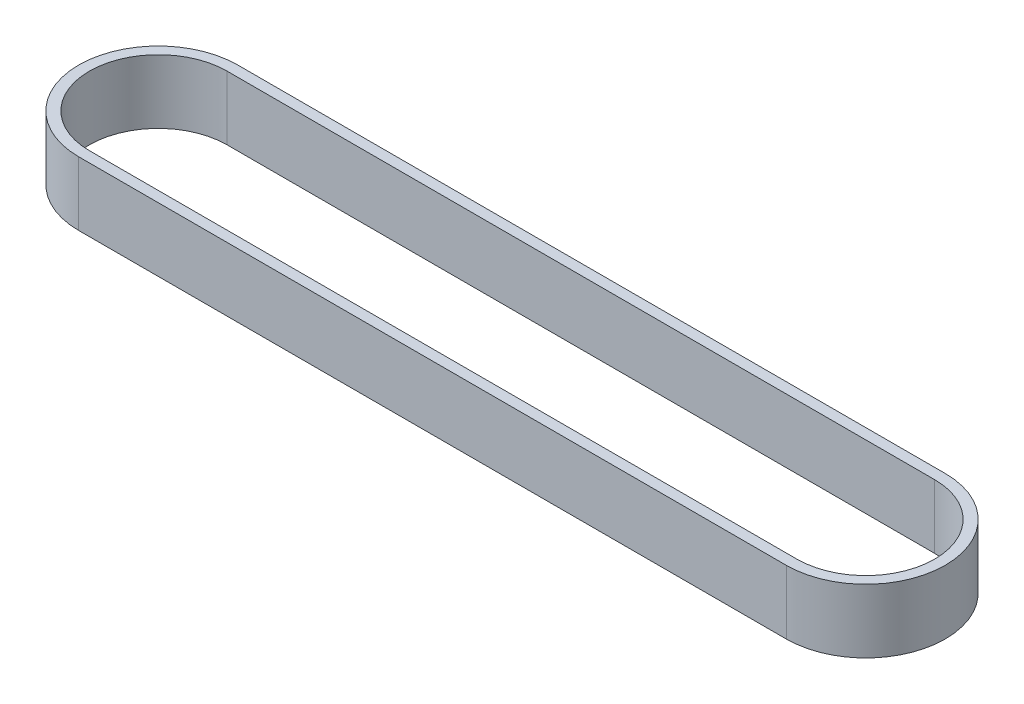
ISO-10303-21;
HEADER;
FILE_DESCRIPTION(('STEP AP214'),'2;1');
FILE_NAME('part.step','',(''),(''),'','','');
FILE_SCHEMA(('AUTOMOTIVE_DESIGN { 1 0 10303 214 1 1 1 1 }'));
ENDSEC;
DATA;
#1=APPLICATION_CONTEXT('core data for automotive mechanical design processes');
#2=APPLICATION_PROTOCOL_DEFINITION('international standard','automotive_design',2000,#1);
#3=PRODUCT_CONTEXT('',#1,'mechanical');
#4=PRODUCT('Part','Part','',(#3));
#5=PRODUCT_RELATED_PRODUCT_CATEGORY('part','',(#4));
#6=PRODUCT_DEFINITION_FORMATION('','',#4);
#7=PRODUCT_DEFINITION_CONTEXT('part definition',#1,'design');
#8=PRODUCT_DEFINITION('design','',#6,#7);
#9=PRODUCT_DEFINITION_SHAPE('','',#8);
#10=(LENGTH_UNIT() NAMED_UNIT(*) SI_UNIT(.MILLI.,.METRE.));
#11=(NAMED_UNIT(*) PLANE_ANGLE_UNIT() SI_UNIT($,.RADIAN.));
#12=(NAMED_UNIT(*) SI_UNIT($,.STERADIAN.) SOLID_ANGLE_UNIT());
#13=UNCERTAINTY_MEASURE_WITH_UNIT(LENGTH_MEASURE(1.E-05),#10,'distance_accuracy_value','');
#14=(GEOMETRIC_REPRESENTATION_CONTEXT(3) GLOBAL_UNCERTAINTY_ASSIGNED_CONTEXT((#13)) GLOBAL_UNIT_ASSIGNED_CONTEXT((#10,
#11,#12)) REPRESENTATION_CONTEXT('',''));
#15=CARTESIAN_POINT('',(0.,0.,0.));
#16=DIRECTION('',(0.,0.,1.));
#17=DIRECTION('',(1.,0.,0.));
#18=AXIS2_PLACEMENT_3D('',#15,#16,#17);
#19=CARTESIAN_POINT('',(-33.24,6.,0.));
#20=DIRECTION('',(0.,1.,0.));
#21=DIRECTION('',(0.,0.,1.));
#22=AXIS2_PLACEMENT_3D('',#19,#20,#21);
#23=PLANE('',#22);
#24=CARTESIAN_POINT('',(-33.24,6.,0.));
#25=DIRECTION('',(0.,1.,0.));
#26=DIRECTION('',(0.,0.,1.));
#27=AXIS2_PLACEMENT_3D('',#24,#25,#26);
#28=CIRCLE('',#27,7.47);
#29=CARTESIAN_POINT('',(-33.24,6.,-7.47));
#30=VERTEX_POINT('',#29);
#31=CARTESIAN_POINT('',(-33.24,6.,7.47));
#32=VERTEX_POINT('',#31);
#33=EDGE_CURVE('E133',#30,#32,#28,.T.);
#34=ORIENTED_EDGE('',*,*,#33,.T.);
#35=DIRECTION('',(1.,0.,0.));
#36=VECTOR('',#35,1.);
#37=CARTESIAN_POINT('',(-33.24,6.,7.47));
#38=LINE('',#37,#36);
#39=CARTESIAN_POINT('',(33.24,6.,7.47));
#40=VERTEX_POINT('',#39);
#41=EDGE_CURVE('E136',#32,#40,#38,.T.);
#42=ORIENTED_EDGE('',*,*,#41,.T.);
#43=CARTESIAN_POINT('',(33.24,6.,0.));
#44=DIRECTION('',(0.,1.,0.));
#45=DIRECTION('',(0.,0.,1.));
#46=AXIS2_PLACEMENT_3D('',#43,#44,#45);
#47=CIRCLE('',#46,7.47);
#48=CARTESIAN_POINT('',(33.24,6.,-7.47));
#49=VERTEX_POINT('',#48);
#50=EDGE_CURVE('E139',#40,#49,#47,.T.);
#51=ORIENTED_EDGE('',*,*,#50,.T.);
#52=DIRECTION('',(-1.,0.,0.));
#53=VECTOR('',#52,1.);
#54=CARTESIAN_POINT('',(-33.24,6.,-7.47));
#55=LINE('',#54,#53);
#56=EDGE_CURVE('E141',#49,#30,#55,.T.);
#57=ORIENTED_EDGE('',*,*,#56,.T.);
#58=EDGE_LOOP('',(#34,#42,#51,#57));
#59=FACE_BOUND('',#58,.T.);
#60=DIRECTION('',(-1.,0.,0.));
#61=VECTOR('',#60,1.);
#62=CARTESIAN_POINT('',(-33.24,6.,-6.47));
#63=LINE('',#62,#61);
#64=CARTESIAN_POINT('',(33.24,6.,-6.47));
#65=VERTEX_POINT('',#64);
#66=CARTESIAN_POINT('',(-33.24,6.,-6.47));
#67=VERTEX_POINT('',#66);
#68=EDGE_CURVE('E105',#65,#67,#63,.T.);
#69=ORIENTED_EDGE('',*,*,#68,.F.);
#70=CARTESIAN_POINT('',(33.24,6.,0.));
#71=DIRECTION('',(0.,1.,0.));
#72=DIRECTION('',(0.,0.,1.));
#73=AXIS2_PLACEMENT_3D('',#70,#71,#72);
#74=CIRCLE('',#73,6.47);
#75=CARTESIAN_POINT('',(33.24,6.,6.47));
#76=VERTEX_POINT('',#75);
#77=EDGE_CURVE('E97',#76,#65,#74,.T.);
#78=ORIENTED_EDGE('',*,*,#77,.F.);
#79=DIRECTION('',(1.,0.,0.));
#80=VECTOR('',#79,1.);
#81=CARTESIAN_POINT('',(-33.24,6.,6.47));
#82=LINE('',#81,#80);
#83=CARTESIAN_POINT('',(-33.24,6.,6.47));
#84=VERTEX_POINT('',#83);
#85=EDGE_CURVE('E119',#84,#76,#82,.T.);
#86=ORIENTED_EDGE('',*,*,#85,.F.);
#87=CARTESIAN_POINT('',(-33.24,6.,0.));
#88=DIRECTION('',(0.,1.,0.));
#89=DIRECTION('',(0.,0.,1.));
#90=AXIS2_PLACEMENT_3D('',#87,#88,#89);
#91=CIRCLE('',#90,6.47);
#92=EDGE_CURVE('E117',#67,#84,#91,.T.);
#93=ORIENTED_EDGE('',*,*,#92,.F.);
#94=EDGE_LOOP('',(#69,#78,#86,#93));
#95=FACE_BOUND('',#94,.T.);
#96=ADVANCED_FACE('F32',(#59,#95),#23,.T.);
#97=CARTESIAN_POINT('',(-33.24,0.,0.));
#98=DIRECTION('',(0.,1.,0.));
#99=DIRECTION('',(0.,0.,1.));
#100=AXIS2_PLACEMENT_3D('',#97,#98,#99);
#101=PLANE('',#100);
#102=CARTESIAN_POINT('',(-33.24,0.,0.));
#103=DIRECTION('',(0.,1.,0.));
#104=DIRECTION('',(0.,0.,1.));
#105=AXIS2_PLACEMENT_3D('',#102,#103,#104);
#106=CIRCLE('',#105,7.47);
#107=CARTESIAN_POINT('',(-33.24,0.,-7.47));
#108=VERTEX_POINT('',#107);
#109=CARTESIAN_POINT('',(-33.24,0.,7.47));
#110=VERTEX_POINT('',#109);
#111=EDGE_CURVE('E113',#108,#110,#106,.T.);
#112=ORIENTED_EDGE('',*,*,#111,.F.);
#113=DIRECTION('',(-1.,0.,0.));
#114=VECTOR('',#113,1.);
#115=CARTESIAN_POINT('',(-33.24,0.,-7.47));
#116=LINE('',#115,#114);
#117=CARTESIAN_POINT('',(33.24,0.,-7.47));
#118=VERTEX_POINT('',#117);
#119=EDGE_CURVE('E137',#118,#108,#116,.T.);
#120=ORIENTED_EDGE('',*,*,#119,.F.);
#121=CARTESIAN_POINT('',(33.24,0.,0.));
#122=DIRECTION('',(0.,1.,0.));
#123=DIRECTION('',(0.,0.,1.));
#124=AXIS2_PLACEMENT_3D('',#121,#122,#123);
#125=CIRCLE('',#124,7.47);
#126=CARTESIAN_POINT('',(33.24,0.,7.47));
#127=VERTEX_POINT('',#126);
#128=EDGE_CURVE('E148',#127,#118,#125,.T.);
#129=ORIENTED_EDGE('',*,*,#128,.F.);
#130=DIRECTION('',(1.,0.,0.));
#131=VECTOR('',#130,1.);
#132=CARTESIAN_POINT('',(-33.24,0.,7.47));
#133=LINE('',#132,#131);
#134=EDGE_CURVE('E146',#110,#127,#133,.T.);
#135=ORIENTED_EDGE('',*,*,#134,.F.);
#136=EDGE_LOOP('',(#112,#120,#129,#135));
#137=FACE_BOUND('',#136,.T.);
#138=CARTESIAN_POINT('',(33.24,0.,0.));
#139=DIRECTION('',(0.,1.,0.));
#140=DIRECTION('',(0.,0.,1.));
#141=AXIS2_PLACEMENT_3D('',#138,#139,#140);
#142=CIRCLE('',#141,6.47);
#143=CARTESIAN_POINT('',(33.24,0.,6.47));
#144=VERTEX_POINT('',#143);
#145=CARTESIAN_POINT('',(33.24,0.,-6.47));
#146=VERTEX_POINT('',#145);
#147=EDGE_CURVE('E55',#144,#146,#142,.T.);
#148=ORIENTED_EDGE('',*,*,#147,.T.);
#149=DIRECTION('',(-1.,0.,0.));
#150=VECTOR('',#149,1.);
#151=CARTESIAN_POINT('',(-33.24,0.,-6.47));
#152=LINE('',#151,#150);
#153=CARTESIAN_POINT('',(-33.24,0.,-6.47));
#154=VERTEX_POINT('',#153);
#155=EDGE_CURVE('E112',#146,#154,#152,.T.);
#156=ORIENTED_EDGE('',*,*,#155,.T.);
#157=CARTESIAN_POINT('',(-33.24,0.,0.));
#158=DIRECTION('',(0.,1.,0.));
#159=DIRECTION('',(0.,0.,1.));
#160=AXIS2_PLACEMENT_3D('',#157,#158,#159);
#161=CIRCLE('',#160,6.47);
#162=CARTESIAN_POINT('',(-33.24,0.,6.47));
#163=VERTEX_POINT('',#162);
#164=EDGE_CURVE('E125',#154,#163,#161,.T.);
#165=ORIENTED_EDGE('',*,*,#164,.T.);
#166=DIRECTION('',(1.,0.,0.));
#167=VECTOR('',#166,1.);
#168=CARTESIAN_POINT('',(-33.24,0.,6.47));
#169=LINE('',#168,#167);
#170=EDGE_CURVE('E106',#163,#144,#169,.T.);
#171=ORIENTED_EDGE('',*,*,#170,.T.);
#172=EDGE_LOOP('',(#148,#156,#165,#171));
#173=FACE_BOUND('',#172,.T.);
#174=ADVANCED_FACE('F166',(#137,#173),#101,.F.);
#175=CARTESIAN_POINT('',(-33.24,6.,0.));
#176=DIRECTION('',(0.,-1.,0.));
#177=DIRECTION('',(0.,0.,-1.));
#178=AXIS2_PLACEMENT_3D('',#175,#176,#177);
#179=CYLINDRICAL_SURFACE('',#178,7.47);
#180=ORIENTED_EDGE('',*,*,#111,.T.);
#181=DIRECTION('',(0.,-1.,0.));
#182=VECTOR('',#181,1.);
#183=CARTESIAN_POINT('',(-33.24,6.,7.47));
#184=LINE('',#183,#182);
#185=EDGE_CURVE('E11',#32,#110,#184,.T.);
#186=ORIENTED_EDGE('',*,*,#185,.F.);
#187=ORIENTED_EDGE('',*,*,#33,.F.);
#188=DIRECTION('',(0.,-1.,0.));
#189=VECTOR('',#188,1.);
#190=CARTESIAN_POINT('',(-33.24,6.,-7.47));
#191=LINE('',#190,#189);
#192=EDGE_CURVE('E143',#30,#108,#191,.T.);
#193=ORIENTED_EDGE('',*,*,#192,.T.);
#194=EDGE_LOOP('',(#180,#186,#187,#193));
#195=FACE_BOUND('',#194,.T.);
#196=ADVANCED_FACE('F34',(#195),#179,.T.);
#197=CARTESIAN_POINT('',(-33.24,6.,7.47));
#198=DIRECTION('',(0.,0.,-1.));
#199=DIRECTION('',(-1.,0.,0.));
#200=AXIS2_PLACEMENT_3D('',#197,#198,#199);
#201=PLANE('',#200);
#202=ORIENTED_EDGE('',*,*,#134,.T.);
#203=DIRECTION('',(0.,-1.,0.));
#204=VECTOR('',#203,1.);
#205=CARTESIAN_POINT('',(33.24,6.,7.47));
#206=LINE('',#205,#204);
#207=EDGE_CURVE('E40',#40,#127,#206,.T.);
#208=ORIENTED_EDGE('',*,*,#207,.F.);
#209=ORIENTED_EDGE('',*,*,#41,.F.);
#210=ORIENTED_EDGE('',*,*,#185,.T.);
#211=EDGE_LOOP('',(#202,#208,#209,#210));
#212=FACE_BOUND('',#211,.T.);
#213=ADVANCED_FACE('F176',(#212),#201,.F.);
#214=CARTESIAN_POINT('',(33.24,6.,0.));
#215=DIRECTION('',(0.,-1.,0.));
#216=DIRECTION('',(0.,0.,-1.));
#217=AXIS2_PLACEMENT_3D('',#214,#215,#216);
#218=CYLINDRICAL_SURFACE('',#217,7.47);
#219=ORIENTED_EDGE('',*,*,#128,.T.);
#220=DIRECTION('',(0.,-1.,0.));
#221=VECTOR('',#220,1.);
#222=CARTESIAN_POINT('',(33.24,6.,-7.47));
#223=LINE('',#222,#221);
#224=EDGE_CURVE('E153',#49,#118,#223,.T.);
#225=ORIENTED_EDGE('',*,*,#224,.F.);
#226=ORIENTED_EDGE('',*,*,#50,.F.);
#227=ORIENTED_EDGE('',*,*,#207,.T.);
#228=EDGE_LOOP('',(#219,#225,#226,#227));
#229=FACE_BOUND('',#228,.T.);
#230=ADVANCED_FACE('F160',(#229),#218,.T.);
#231=CARTESIAN_POINT('',(-33.24,6.,-7.47));
#232=DIRECTION('',(0.,0.,1.));
#233=DIRECTION('',(1.,0.,0.));
#234=AXIS2_PLACEMENT_3D('',#231,#232,#233);
#235=PLANE('',#234);
#236=ORIENTED_EDGE('',*,*,#119,.T.);
#237=ORIENTED_EDGE('',*,*,#192,.F.);
#238=ORIENTED_EDGE('',*,*,#56,.F.);
#239=ORIENTED_EDGE('',*,*,#224,.T.);
#240=EDGE_LOOP('',(#236,#237,#238,#239));
#241=FACE_BOUND('',#240,.T.);
#242=ADVANCED_FACE('F170',(#241),#235,.F.);
#243=CARTESIAN_POINT('',(33.24,6.,0.));
#244=DIRECTION('',(0.,-1.,0.));
#245=DIRECTION('',(0.,0.,-1.));
#246=AXIS2_PLACEMENT_3D('',#243,#244,#245);
#247=CYLINDRICAL_SURFACE('',#246,6.47);
#248=ORIENTED_EDGE('',*,*,#147,.F.);
#249=DIRECTION('',(0.,-1.,0.));
#250=VECTOR('',#249,1.);
#251=CARTESIAN_POINT('',(33.24,6.,6.47));
#252=LINE('',#251,#250);
#253=EDGE_CURVE('E101',#76,#144,#252,.T.);
#254=ORIENTED_EDGE('',*,*,#253,.F.);
#255=ORIENTED_EDGE('',*,*,#77,.T.);
#256=DIRECTION('',(0.,-1.,0.));
#257=VECTOR('',#256,1.);
#258=CARTESIAN_POINT('',(33.24,6.,-6.47));
#259=LINE('',#258,#257);
#260=EDGE_CURVE('E100',#65,#146,#259,.T.);
#261=ORIENTED_EDGE('',*,*,#260,.T.);
#262=EDGE_LOOP('',(#248,#254,#255,#261));
#263=FACE_BOUND('',#262,.T.);
#264=ADVANCED_FACE('F99',(#263),#247,.F.);
#265=CARTESIAN_POINT('',(-33.24,6.,-6.47));
#266=DIRECTION('',(0.,0.,1.));
#267=DIRECTION('',(1.,0.,0.));
#268=AXIS2_PLACEMENT_3D('',#265,#266,#267);
#269=PLANE('',#268);
#270=ORIENTED_EDGE('',*,*,#155,.F.);
#271=ORIENTED_EDGE('',*,*,#260,.F.);
#272=ORIENTED_EDGE('',*,*,#68,.T.);
#273=DIRECTION('',(0.,-1.,0.));
#274=VECTOR('',#273,1.);
#275=CARTESIAN_POINT('',(-33.24,6.,-6.47));
#276=LINE('',#275,#274);
#277=EDGE_CURVE('E114',#67,#154,#276,.T.);
#278=ORIENTED_EDGE('',*,*,#277,.T.);
#279=EDGE_LOOP('',(#270,#271,#272,#278));
#280=FACE_BOUND('',#279,.T.);
#281=ADVANCED_FACE('F109',(#280),#269,.T.);
#282=CARTESIAN_POINT('',(-33.24,6.,0.));
#283=DIRECTION('',(0.,-1.,0.));
#284=DIRECTION('',(0.,0.,-1.));
#285=AXIS2_PLACEMENT_3D('',#282,#283,#284);
#286=CYLINDRICAL_SURFACE('',#285,6.47);
#287=ORIENTED_EDGE('',*,*,#164,.F.);
#288=ORIENTED_EDGE('',*,*,#277,.F.);
#289=ORIENTED_EDGE('',*,*,#92,.T.);
#290=DIRECTION('',(0.,-1.,0.));
#291=VECTOR('',#290,1.);
#292=CARTESIAN_POINT('',(-33.24,6.,6.47));
#293=LINE('',#292,#291);
#294=EDGE_CURVE('E47',#84,#163,#293,.T.);
#295=ORIENTED_EDGE('',*,*,#294,.T.);
#296=EDGE_LOOP('',(#287,#288,#289,#295));
#297=FACE_BOUND('',#296,.T.);
#298=ADVANCED_FACE('F199',(#297),#286,.F.);
#299=CARTESIAN_POINT('',(-33.24,6.,6.47));
#300=DIRECTION('',(0.,0.,-1.));
#301=DIRECTION('',(-1.,0.,0.));
#302=AXIS2_PLACEMENT_3D('',#299,#300,#301);
#303=PLANE('',#302);
#304=ORIENTED_EDGE('',*,*,#170,.F.);
#305=ORIENTED_EDGE('',*,*,#294,.F.);
#306=ORIENTED_EDGE('',*,*,#85,.T.);
#307=ORIENTED_EDGE('',*,*,#253,.T.);
#308=EDGE_LOOP('',(#304,#305,#306,#307));
#309=FACE_BOUND('',#308,.T.);
#310=ADVANCED_FACE('F203',(#309),#303,.T.);
#311=CLOSED_SHELL('',(#96,#174,#196,#213,#230,#242,#264,#281,#298,#310));
#312=MANIFOLD_SOLID_BREP('B2',#311);
#313=ADVANCED_BREP_SHAPE_REPRESENTATION('',(#18,#312),#14);
#314=SHAPE_DEFINITION_REPRESENTATION(#9,#313);
ENDSEC;
END-ISO-10303-21;
